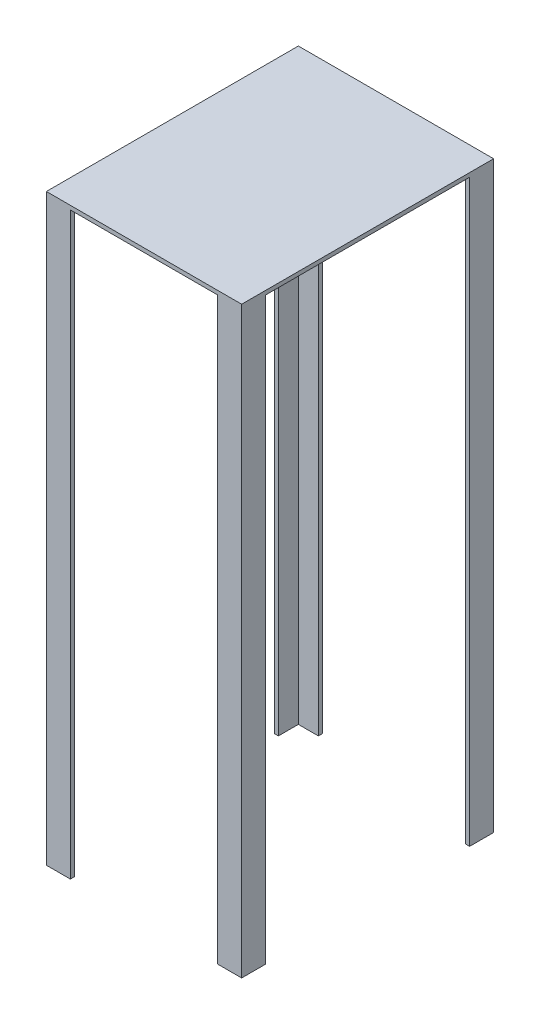
ISO-10303-21;
HEADER;
FILE_DESCRIPTION(('STEP AP214'),'2;1');
FILE_NAME('part.step','',(''),(''),'','','');
FILE_SCHEMA(('AUTOMOTIVE_DESIGN { 1 0 10303 214 1 1 1 1 }'));
ENDSEC;
DATA;
#1=APPLICATION_CONTEXT('core data for automotive mechanical design processes');
#2=APPLICATION_PROTOCOL_DEFINITION('international standard','automotive_design',2000,#1);
#3=PRODUCT_CONTEXT('',#1,'mechanical');
#4=PRODUCT('Part','Part','',(#3));
#5=PRODUCT_RELATED_PRODUCT_CATEGORY('part','',(#4));
#6=PRODUCT_DEFINITION_FORMATION('','',#4);
#7=PRODUCT_DEFINITION_CONTEXT('part definition',#1,'design');
#8=PRODUCT_DEFINITION('design','',#6,#7);
#9=PRODUCT_DEFINITION_SHAPE('','',#8);
#10=(LENGTH_UNIT() NAMED_UNIT(*) SI_UNIT(.MILLI.,.METRE.));
#11=(NAMED_UNIT(*) PLANE_ANGLE_UNIT() SI_UNIT($,.RADIAN.));
#12=(NAMED_UNIT(*) SI_UNIT($,.STERADIAN.) SOLID_ANGLE_UNIT());
#13=UNCERTAINTY_MEASURE_WITH_UNIT(LENGTH_MEASURE(1.E-05),#10,'distance_accuracy_value','');
#14=(GEOMETRIC_REPRESENTATION_CONTEXT(3) GLOBAL_UNCERTAINTY_ASSIGNED_CONTEXT((#13)) GLOBAL_UNIT_ASSIGNED_CONTEXT((#10,
#11,#12)) REPRESENTATION_CONTEXT('',''));
#15=CARTESIAN_POINT('',(0.,0.,0.));
#16=DIRECTION('',(0.,0.,1.));
#17=DIRECTION('',(1.,0.,0.));
#18=AXIS2_PLACEMENT_3D('',#15,#16,#17);
#19=CARTESIAN_POINT('',(0.,-6.35,0.));
#20=DIRECTION('',(0.,-1.,0.));
#21=DIRECTION('',(0.,0.,-1.));
#22=AXIS2_PLACEMENT_3D('',#19,#20,#21);
#23=PLANE('',#22);
#24=DIRECTION('',(-1.,0.,0.));
#25=VECTOR('',#24,1.);
#26=CARTESIAN_POINT('',(6.35,-6.35,-393.65));
#27=LINE('',#26,#25);
#28=CARTESIAN_POINT('',(38.1,-6.35,-393.65));
#29=VERTEX_POINT('',#28);
#30=CARTESIAN_POINT('',(6.35,-6.35,-393.65));
#31=VERTEX_POINT('',#30);
#32=EDGE_CURVE('E383',#29,#31,#27,.T.);
#33=ORIENTED_EDGE('',*,*,#32,.F.);
#34=DIRECTION('',(0.,0.,1.));
#35=VECTOR('',#34,1.);
#36=CARTESIAN_POINT('',(38.1,-6.35,-393.65));
#37=LINE('',#36,#35);
#38=CARTESIAN_POINT('',(38.1,-6.35,-400.));
#39=VERTEX_POINT('',#38);
#40=EDGE_CURVE('E381',#39,#29,#37,.T.);
#41=ORIENTED_EDGE('',*,*,#40,.F.);
#42=DIRECTION('',(-1.,0.,0.));
#43=VECTOR('',#42,1.);
#44=CARTESIAN_POINT('',(0.,-6.35,-400.));
#45=LINE('',#44,#43);
#46=CARTESIAN_POINT('',(271.9,-6.35,-400.));
#47=VERTEX_POINT('',#46);
#48=EDGE_CURVE('E222',#47,#39,#45,.T.);
#49=ORIENTED_EDGE('',*,*,#48,.F.);
#50=DIRECTION('',(0.,0.,-1.));
#51=VECTOR('',#50,1.);
#52=CARTESIAN_POINT('',(271.9,-6.35,-393.65));
#53=LINE('',#52,#51);
#54=CARTESIAN_POINT('',(271.9,-6.35,-393.65));
#55=VERTEX_POINT('',#54);
#56=EDGE_CURVE('E235',#55,#47,#53,.T.);
#57=ORIENTED_EDGE('',*,*,#56,.F.);
#58=DIRECTION('',(-1.,0.,0.));
#59=VECTOR('',#58,1.);
#60=CARTESIAN_POINT('',(303.65,-6.35,-393.65));
#61=LINE('',#60,#59);
#62=CARTESIAN_POINT('',(303.65,-6.35,-393.65));
#63=VERTEX_POINT('',#62);
#64=EDGE_CURVE('E248',#63,#55,#61,.T.);
#65=ORIENTED_EDGE('',*,*,#64,.F.);
#66=DIRECTION('',(0.,0.,-1.));
#67=VECTOR('',#66,1.);
#68=CARTESIAN_POINT('',(303.65,-6.35,-393.65));
#69=LINE('',#68,#67);
#70=CARTESIAN_POINT('',(303.65,-6.35,-361.9));
#71=VERTEX_POINT('',#70);
#72=EDGE_CURVE('E225',#71,#63,#69,.T.);
#73=ORIENTED_EDGE('',*,*,#72,.F.);
#74=DIRECTION('',(-1.,0.,0.));
#75=VECTOR('',#74,1.);
#76=CARTESIAN_POINT('',(303.65,-6.35,-361.9));
#77=LINE('',#76,#75);
#78=CARTESIAN_POINT('',(310.,-6.35,-361.9));
#79=VERTEX_POINT('',#78);
#80=EDGE_CURVE('E223',#79,#71,#77,.T.);
#81=ORIENTED_EDGE('',*,*,#80,.F.);
#82=DIRECTION('',(0.,0.,-1.));
#83=VECTOR('',#82,1.);
#84=CARTESIAN_POINT('',(310.,-6.35,0.));
#85=LINE('',#84,#83);
#86=CARTESIAN_POINT('',(310.,-6.35,-38.1));
#87=VERTEX_POINT('',#86);
#88=EDGE_CURVE('E342',#87,#79,#85,.T.);
#89=ORIENTED_EDGE('',*,*,#88,.F.);
#90=DIRECTION('',(1.,0.,0.));
#91=VECTOR('',#90,1.);
#92=CARTESIAN_POINT('',(303.65,-6.35,-38.1));
#93=LINE('',#92,#91);
#94=CARTESIAN_POINT('',(303.65,-6.35,-38.1));
#95=VERTEX_POINT('',#94);
#96=EDGE_CURVE('E268',#95,#87,#93,.T.);
#97=ORIENTED_EDGE('',*,*,#96,.F.);
#98=DIRECTION('',(0.,0.,-1.));
#99=VECTOR('',#98,1.);
#100=CARTESIAN_POINT('',(303.65,-6.35,-6.35));
#101=LINE('',#100,#99);
#102=CARTESIAN_POINT('',(303.65,-6.35,-6.35));
#103=VERTEX_POINT('',#102);
#104=EDGE_CURVE('E282',#103,#95,#101,.T.);
#105=ORIENTED_EDGE('',*,*,#104,.F.);
#106=DIRECTION('',(1.,0.,0.));
#107=VECTOR('',#106,1.);
#108=CARTESIAN_POINT('',(303.65,-6.35,-6.35));
#109=LINE('',#108,#107);
#110=CARTESIAN_POINT('',(271.9,-6.35,-6.35));
#111=VERTEX_POINT('',#110);
#112=EDGE_CURVE('E280',#111,#103,#109,.T.);
#113=ORIENTED_EDGE('',*,*,#112,.F.);
#114=DIRECTION('',(0.,0.,-1.));
#115=VECTOR('',#114,1.);
#116=CARTESIAN_POINT('',(271.9,-6.35,-6.35));
#117=LINE('',#116,#115);
#118=CARTESIAN_POINT('',(271.9,-6.35,0.));
#119=VERTEX_POINT('',#118);
#120=EDGE_CURVE('E263',#119,#111,#117,.T.);
#121=ORIENTED_EDGE('',*,*,#120,.F.);
#122=DIRECTION('',(1.,0.,0.));
#123=VECTOR('',#122,1.);
#124=CARTESIAN_POINT('',(0.,-6.35,0.));
#125=LINE('',#124,#123);
#126=CARTESIAN_POINT('',(38.1,-6.35,0.));
#127=VERTEX_POINT('',#126);
#128=EDGE_CURVE('E338',#127,#119,#125,.T.);
#129=ORIENTED_EDGE('',*,*,#128,.F.);
#130=DIRECTION('',(0.,0.,1.));
#131=VECTOR('',#130,1.);
#132=CARTESIAN_POINT('',(38.1,-6.35,-6.35));
#133=LINE('',#132,#131);
#134=CARTESIAN_POINT('',(38.1,-6.35,-6.35));
#135=VERTEX_POINT('',#134);
#136=EDGE_CURVE('E58',#135,#127,#133,.T.);
#137=ORIENTED_EDGE('',*,*,#136,.F.);
#138=DIRECTION('',(1.,0.,0.));
#139=VECTOR('',#138,1.);
#140=CARTESIAN_POINT('',(6.35,-6.35,-6.35));
#141=LINE('',#140,#139);
#142=CARTESIAN_POINT('',(6.35,-6.35,-6.35));
#143=VERTEX_POINT('',#142);
#144=EDGE_CURVE('E318',#143,#135,#141,.T.);
#145=ORIENTED_EDGE('',*,*,#144,.F.);
#146=DIRECTION('',(0.,0.,1.));
#147=VECTOR('',#146,1.);
#148=CARTESIAN_POINT('',(6.35,-6.35,-6.35));
#149=LINE('',#148,#147);
#150=CARTESIAN_POINT('',(6.35,-6.35,-38.1));
#151=VERTEX_POINT('',#150);
#152=EDGE_CURVE('E315',#151,#143,#149,.T.);
#153=ORIENTED_EDGE('',*,*,#152,.F.);
#154=DIRECTION('',(1.,0.,0.));
#155=VECTOR('',#154,1.);
#156=CARTESIAN_POINT('',(6.35,-6.35,-38.1));
#157=LINE('',#156,#155);
#158=CARTESIAN_POINT('',(0.,-6.35,-38.1));
#159=VERTEX_POINT('',#158);
#160=EDGE_CURVE('E297',#159,#151,#157,.T.);
#161=ORIENTED_EDGE('',*,*,#160,.F.);
#162=DIRECTION('',(0.,0.,1.));
#163=VECTOR('',#162,1.);
#164=CARTESIAN_POINT('',(0.,-6.35,0.));
#165=LINE('',#164,#163);
#166=CARTESIAN_POINT('',(0.,-6.35,-361.9));
#167=VERTEX_POINT('',#166);
#168=EDGE_CURVE('E336',#167,#159,#165,.T.);
#169=ORIENTED_EDGE('',*,*,#168,.F.);
#170=DIRECTION('',(-1.,0.,0.));
#171=VECTOR('',#170,1.);
#172=CARTESIAN_POINT('',(6.35,-6.35,-361.9));
#173=LINE('',#172,#171);
#174=CARTESIAN_POINT('',(6.35,-6.35,-361.9));
#175=VERTEX_POINT('',#174);
#176=EDGE_CURVE('E215',#175,#167,#173,.T.);
#177=ORIENTED_EDGE('',*,*,#176,.F.);
#178=DIRECTION('',(0.,0.,1.));
#179=VECTOR('',#178,1.);
#180=CARTESIAN_POINT('',(6.35,-6.35,-393.65));
#181=LINE('',#180,#179);
#182=EDGE_CURVE('E385',#31,#175,#181,.T.);
#183=ORIENTED_EDGE('',*,*,#182,.F.);
#184=EDGE_LOOP('',(#33,#41,#49,#57,#65,#73,#81,#89,#97,#105,#113,#121,#129,#137,#145,#153,#161,
#169,#177,#183));
#185=FACE_BOUND('',#184,.T.);
#186=ADVANCED_FACE('F33',(#185),#23,.T.);
#187=CARTESIAN_POINT('',(0.,-6.35,0.));
#188=DIRECTION('',(-1.,0.,0.));
#189=DIRECTION('',(0.,0.,1.));
#190=AXIS2_PLACEMENT_3D('',#187,#188,#189);
#191=PLANE('',#190);
#192=DIRECTION('',(0.,0.,1.));
#193=VECTOR('',#192,1.);
#194=CARTESIAN_POINT('',(0.,0.,0.));
#195=LINE('',#194,#193);
#196=CARTESIAN_POINT('',(0.,0.,-400.));
#197=VERTEX_POINT('',#196);
#198=CARTESIAN_POINT('',(0.,0.,0.));
#199=VERTEX_POINT('',#198);
#200=EDGE_CURVE('E335',#197,#199,#195,.T.);
#201=ORIENTED_EDGE('',*,*,#200,.F.);
#202=DIRECTION('',(0.,1.,0.));
#203=VECTOR('',#202,1.);
#204=CARTESIAN_POINT('',(0.,-6.35,-400.));
#205=LINE('',#204,#203);
#206=CARTESIAN_POINT('',(0.,-926.35,-400.));
#207=VERTEX_POINT('',#206);
#208=EDGE_CURVE('E11',#207,#197,#205,.T.);
#209=ORIENTED_EDGE('',*,*,#208,.F.);
#210=DIRECTION('',(0.,0.,-1.));
#211=VECTOR('',#210,1.);
#212=CARTESIAN_POINT('',(0.,-926.35,-400.));
#213=LINE('',#212,#211);
#214=CARTESIAN_POINT('',(0.,-926.35,-361.9));
#215=VERTEX_POINT('',#214);
#216=EDGE_CURVE('E213',#215,#207,#213,.T.);
#217=ORIENTED_EDGE('',*,*,#216,.F.);
#218=DIRECTION('',(0.,1.,0.));
#219=VECTOR('',#218,1.);
#220=CARTESIAN_POINT('',(0.,-926.35,-361.9));
#221=LINE('',#220,#219);
#222=EDGE_CURVE('E371',#215,#167,#221,.T.);
#223=ORIENTED_EDGE('',*,*,#222,.T.);
#224=ORIENTED_EDGE('',*,*,#168,.T.);
#225=DIRECTION('',(0.,1.,0.));
#226=VECTOR('',#225,1.);
#227=CARTESIAN_POINT('',(0.,-926.35,-38.1));
#228=LINE('',#227,#226);
#229=CARTESIAN_POINT('',(0.,-926.35,-38.1));
#230=VERTEX_POINT('',#229);
#231=EDGE_CURVE('E332',#230,#159,#228,.T.);
#232=ORIENTED_EDGE('',*,*,#231,.F.);
#233=DIRECTION('',(0.,0.,-1.));
#234=VECTOR('',#233,1.);
#235=CARTESIAN_POINT('',(0.,-926.35,0.));
#236=LINE('',#235,#234);
#237=CARTESIAN_POINT('',(0.,-926.35,0.));
#238=VERTEX_POINT('',#237);
#239=EDGE_CURVE('E298',#238,#230,#236,.T.);
#240=ORIENTED_EDGE('',*,*,#239,.F.);
#241=DIRECTION('',(0.,1.,0.));
#242=VECTOR('',#241,1.);
#243=CARTESIAN_POINT('',(0.,-6.35,0.));
#244=LINE('',#243,#242);
#245=EDGE_CURVE('E37',#238,#199,#244,.T.);
#246=ORIENTED_EDGE('',*,*,#245,.T.);
#247=EDGE_LOOP('',(#201,#209,#217,#223,#224,#232,#240,#246));
#248=FACE_BOUND('',#247,.T.);
#249=ADVANCED_FACE('F35',(#248),#191,.T.);
#250=CARTESIAN_POINT('',(0.,-6.35,-400.));
#251=DIRECTION('',(0.,0.,-1.));
#252=DIRECTION('',(-1.,0.,0.));
#253=AXIS2_PLACEMENT_3D('',#250,#251,#252);
#254=PLANE('',#253);
#255=DIRECTION('',(-1.,0.,0.));
#256=VECTOR('',#255,1.);
#257=CARTESIAN_POINT('',(0.,0.,-400.));
#258=LINE('',#257,#256);
#259=CARTESIAN_POINT('',(310.,0.,-400.));
#260=VERTEX_POINT('',#259);
#261=EDGE_CURVE('E339',#260,#197,#258,.T.);
#262=ORIENTED_EDGE('',*,*,#261,.F.);
#263=DIRECTION('',(0.,1.,0.));
#264=VECTOR('',#263,1.);
#265=CARTESIAN_POINT('',(310.,-6.35,-400.));
#266=LINE('',#265,#264);
#267=CARTESIAN_POINT('',(310.,-926.35,-400.));
#268=VERTEX_POINT('',#267);
#269=EDGE_CURVE('E42',#268,#260,#266,.T.);
#270=ORIENTED_EDGE('',*,*,#269,.F.);
#271=DIRECTION('',(1.,0.,0.));
#272=VECTOR('',#271,1.);
#273=CARTESIAN_POINT('',(310.,-926.35,-400.));
#274=LINE('',#273,#272);
#275=CARTESIAN_POINT('',(271.9,-926.35,-400.));
#276=VERTEX_POINT('',#275);
#277=EDGE_CURVE('E243',#276,#268,#274,.T.);
#278=ORIENTED_EDGE('',*,*,#277,.F.);
#279=DIRECTION('',(0.,1.,0.));
#280=VECTOR('',#279,1.);
#281=CARTESIAN_POINT('',(271.9,-926.35,-400.));
#282=LINE('',#281,#280);
#283=EDGE_CURVE('E245',#276,#47,#282,.T.);
#284=ORIENTED_EDGE('',*,*,#283,.T.);
#285=ORIENTED_EDGE('',*,*,#48,.T.);
#286=DIRECTION('',(0.,1.,0.));
#287=VECTOR('',#286,1.);
#288=CARTESIAN_POINT('',(38.1,-926.35,-400.));
#289=LINE('',#288,#287);
#290=CARTESIAN_POINT('',(38.1,-926.35,-400.));
#291=VERTEX_POINT('',#290);
#292=EDGE_CURVE('E200',#291,#39,#289,.T.);
#293=ORIENTED_EDGE('',*,*,#292,.F.);
#294=DIRECTION('',(1.,0.,0.));
#295=VECTOR('',#294,1.);
#296=CARTESIAN_POINT('',(0.,-926.35,-400.));
#297=LINE('',#296,#295);
#298=EDGE_CURVE('E207',#207,#291,#297,.T.);
#299=ORIENTED_EDGE('',*,*,#298,.F.);
#300=ORIENTED_EDGE('',*,*,#208,.T.);
#301=EDGE_LOOP('',(#262,#270,#278,#284,#285,#293,#299,#300));
#302=FACE_BOUND('',#301,.T.);
#303=ADVANCED_FACE('F219',(#302),#254,.T.);
#304=CARTESIAN_POINT('',(310.,-6.35,0.));
#305=DIRECTION('',(1.,0.,0.));
#306=DIRECTION('',(0.,0.,-1.));
#307=AXIS2_PLACEMENT_3D('',#304,#305,#306);
#308=PLANE('',#307);
#309=DIRECTION('',(0.,0.,-1.));
#310=VECTOR('',#309,1.);
#311=CARTESIAN_POINT('',(310.,0.,0.));
#312=LINE('',#311,#310);
#313=CARTESIAN_POINT('',(310.,0.,0.));
#314=VERTEX_POINT('',#313);
#315=EDGE_CURVE('E350',#314,#260,#312,.T.);
#316=ORIENTED_EDGE('',*,*,#315,.F.);
#317=DIRECTION('',(0.,1.,0.));
#318=VECTOR('',#317,1.);
#319=CARTESIAN_POINT('',(310.,-6.35,0.));
#320=LINE('',#319,#318);
#321=CARTESIAN_POINT('',(310.,-926.35,0.));
#322=VERTEX_POINT('',#321);
#323=EDGE_CURVE('E355',#322,#314,#320,.T.);
#324=ORIENTED_EDGE('',*,*,#323,.F.);
#325=DIRECTION('',(0.,0.,1.));
#326=VECTOR('',#325,1.);
#327=CARTESIAN_POINT('',(310.,-926.35,0.));
#328=LINE('',#327,#326);
#329=CARTESIAN_POINT('',(310.,-926.35,-38.1));
#330=VERTEX_POINT('',#329);
#331=EDGE_CURVE('E276',#330,#322,#328,.T.);
#332=ORIENTED_EDGE('',*,*,#331,.F.);
#333=DIRECTION('',(0.,1.,0.));
#334=VECTOR('',#333,1.);
#335=CARTESIAN_POINT('',(310.,-926.35,-38.1));
#336=LINE('',#335,#334);
#337=EDGE_CURVE('E50',#330,#87,#336,.T.);
#338=ORIENTED_EDGE('',*,*,#337,.T.);
#339=ORIENTED_EDGE('',*,*,#88,.T.);
#340=DIRECTION('',(0.,1.,0.));
#341=VECTOR('',#340,1.);
#342=CARTESIAN_POINT('',(310.,-926.35,-361.9));
#343=LINE('',#342,#341);
#344=CARTESIAN_POINT('',(310.,-926.35,-361.9));
#345=VERTEX_POINT('',#344);
#346=EDGE_CURVE('E261',#345,#79,#343,.T.);
#347=ORIENTED_EDGE('',*,*,#346,.F.);
#348=DIRECTION('',(0.,0.,1.));
#349=VECTOR('',#348,1.);
#350=CARTESIAN_POINT('',(310.,-926.35,-400.));
#351=LINE('',#350,#349);
#352=EDGE_CURVE('E231',#268,#345,#351,.T.);
#353=ORIENTED_EDGE('',*,*,#352,.F.);
#354=ORIENTED_EDGE('',*,*,#269,.T.);
#355=EDGE_LOOP('',(#316,#324,#332,#338,#339,#347,#353,#354));
#356=FACE_BOUND('',#355,.T.);
#357=ADVANCED_FACE('F427',(#356),#308,.T.);
#358=CARTESIAN_POINT('',(0.,-6.35,0.));
#359=DIRECTION('',(0.,0.,1.));
#360=DIRECTION('',(1.,0.,0.));
#361=AXIS2_PLACEMENT_3D('',#358,#359,#360);
#362=PLANE('',#361);
#363=DIRECTION('',(1.,0.,0.));
#364=VECTOR('',#363,1.);
#365=CARTESIAN_POINT('',(0.,0.,0.));
#366=LINE('',#365,#364);
#367=EDGE_CURVE('E347',#199,#314,#366,.T.);
#368=ORIENTED_EDGE('',*,*,#367,.F.);
#369=ORIENTED_EDGE('',*,*,#245,.F.);
#370=DIRECTION('',(-1.,0.,0.));
#371=VECTOR('',#370,1.);
#372=CARTESIAN_POINT('',(0.,-926.35,0.));
#373=LINE('',#372,#371);
#374=CARTESIAN_POINT('',(38.1,-926.35,0.));
#375=VERTEX_POINT('',#374);
#376=EDGE_CURVE('E309',#375,#238,#373,.T.);
#377=ORIENTED_EDGE('',*,*,#376,.F.);
#378=DIRECTION('',(0.,1.,0.));
#379=VECTOR('',#378,1.);
#380=CARTESIAN_POINT('',(38.1,-926.35,0.));
#381=LINE('',#380,#379);
#382=EDGE_CURVE('E312',#375,#127,#381,.T.);
#383=ORIENTED_EDGE('',*,*,#382,.T.);
#384=ORIENTED_EDGE('',*,*,#128,.T.);
#385=DIRECTION('',(0.,1.,0.));
#386=VECTOR('',#385,1.);
#387=CARTESIAN_POINT('',(271.9,-926.35,0.));
#388=LINE('',#387,#386);
#389=CARTESIAN_POINT('',(271.9,-926.35,0.));
#390=VERTEX_POINT('',#389);
#391=EDGE_CURVE('E295',#390,#119,#388,.T.);
#392=ORIENTED_EDGE('',*,*,#391,.F.);
#393=DIRECTION('',(-1.,0.,0.));
#394=VECTOR('',#393,1.);
#395=CARTESIAN_POINT('',(310.,-926.35,0.));
#396=LINE('',#395,#394);
#397=EDGE_CURVE('E264',#322,#390,#396,.T.);
#398=ORIENTED_EDGE('',*,*,#397,.F.);
#399=ORIENTED_EDGE('',*,*,#323,.T.);
#400=EDGE_LOOP('',(#368,#369,#377,#383,#384,#392,#398,#399));
#401=FACE_BOUND('',#400,.T.);
#402=ADVANCED_FACE('F365',(#401),#362,.T.);
#403=CARTESIAN_POINT('',(0.,0.,0.));
#404=DIRECTION('',(0.,-1.,0.));
#405=DIRECTION('',(0.,0.,-1.));
#406=AXIS2_PLACEMENT_3D('',#403,#404,#405);
#407=PLANE('',#406);
#408=ORIENTED_EDGE('',*,*,#200,.T.);
#409=ORIENTED_EDGE('',*,*,#367,.T.);
#410=ORIENTED_EDGE('',*,*,#315,.T.);
#411=ORIENTED_EDGE('',*,*,#261,.T.);
#412=EDGE_LOOP('',(#408,#409,#410,#411));
#413=FACE_BOUND('',#412,.T.);
#414=ADVANCED_FACE('F367',(#413),#407,.F.);
#415=CARTESIAN_POINT('',(6.35,-926.35,-38.1));
#416=DIRECTION('',(0.,0.,1.));
#417=DIRECTION('',(1.,0.,0.));
#418=AXIS2_PLACEMENT_3D('',#415,#416,#417);
#419=PLANE('',#418);
#420=ORIENTED_EDGE('',*,*,#160,.T.);
#421=DIRECTION('',(0.,1.,0.));
#422=VECTOR('',#421,1.);
#423=CARTESIAN_POINT('',(6.35,-926.35,-38.1));
#424=LINE('',#423,#422);
#425=CARTESIAN_POINT('',(6.35,-926.35,-38.1));
#426=VERTEX_POINT('',#425);
#427=EDGE_CURVE('E329',#426,#151,#424,.T.);
#428=ORIENTED_EDGE('',*,*,#427,.F.);
#429=DIRECTION('',(1.,0.,0.));
#430=VECTOR('',#429,1.);
#431=CARTESIAN_POINT('',(6.35,-926.35,-38.1));
#432=LINE('',#431,#430);
#433=EDGE_CURVE('E301',#230,#426,#432,.T.);
#434=ORIENTED_EDGE('',*,*,#433,.F.);
#435=ORIENTED_EDGE('',*,*,#231,.T.);
#436=EDGE_LOOP('',(#420,#428,#434,#435));
#437=FACE_BOUND('',#436,.T.);
#438=ADVANCED_FACE('F421',(#437),#419,.F.);
#439=CARTESIAN_POINT('',(6.35,-926.35,-6.35));
#440=DIRECTION('',(-1.,0.,0.));
#441=DIRECTION('',(0.,0.,1.));
#442=AXIS2_PLACEMENT_3D('',#439,#440,#441);
#443=PLANE('',#442);
#444=ORIENTED_EDGE('',*,*,#152,.T.);
#445=DIRECTION('',(0.,1.,0.));
#446=VECTOR('',#445,1.);
#447=CARTESIAN_POINT('',(6.35,-926.35,-6.35));
#448=LINE('',#447,#446);
#449=CARTESIAN_POINT('',(6.35,-926.35,-6.35));
#450=VERTEX_POINT('',#449);
#451=EDGE_CURVE('E326',#450,#143,#448,.T.);
#452=ORIENTED_EDGE('',*,*,#451,.F.);
#453=DIRECTION('',(0.,0.,1.));
#454=VECTOR('',#453,1.);
#455=CARTESIAN_POINT('',(6.35,-926.35,-6.35));
#456=LINE('',#455,#454);
#457=EDGE_CURVE('E303',#426,#450,#456,.T.);
#458=ORIENTED_EDGE('',*,*,#457,.F.);
#459=ORIENTED_EDGE('',*,*,#427,.T.);
#460=EDGE_LOOP('',(#444,#452,#458,#459));
#461=FACE_BOUND('',#460,.T.);
#462=ADVANCED_FACE('F444',(#461),#443,.F.);
#463=CARTESIAN_POINT('',(6.35,-926.35,-6.35));
#464=DIRECTION('',(0.,0.,1.));
#465=DIRECTION('',(1.,0.,0.));
#466=AXIS2_PLACEMENT_3D('',#463,#464,#465);
#467=PLANE('',#466);
#468=ORIENTED_EDGE('',*,*,#144,.T.);
#469=DIRECTION('',(0.,1.,0.));
#470=VECTOR('',#469,1.);
#471=CARTESIAN_POINT('',(38.1,-926.35,-6.35));
#472=LINE('',#471,#470);
#473=CARTESIAN_POINT('',(38.1,-926.35,-6.35));
#474=VERTEX_POINT('',#473);
#475=EDGE_CURVE('E323',#474,#135,#472,.T.);
#476=ORIENTED_EDGE('',*,*,#475,.F.);
#477=DIRECTION('',(1.,0.,0.));
#478=VECTOR('',#477,1.);
#479=CARTESIAN_POINT('',(6.35,-926.35,-6.35));
#480=LINE('',#479,#478);
#481=EDGE_CURVE('E305',#450,#474,#480,.T.);
#482=ORIENTED_EDGE('',*,*,#481,.F.);
#483=ORIENTED_EDGE('',*,*,#451,.T.);
#484=EDGE_LOOP('',(#468,#476,#482,#483));
#485=FACE_BOUND('',#484,.T.);
#486=ADVANCED_FACE('F451',(#485),#467,.F.);
#487=CARTESIAN_POINT('',(38.1,-926.35,-6.35));
#488=DIRECTION('',(-1.,0.,0.));
#489=DIRECTION('',(0.,0.,1.));
#490=AXIS2_PLACEMENT_3D('',#487,#488,#489);
#491=PLANE('',#490);
#492=ORIENTED_EDGE('',*,*,#136,.T.);
#493=ORIENTED_EDGE('',*,*,#382,.F.);
#494=DIRECTION('',(0.,0.,1.));
#495=VECTOR('',#494,1.);
#496=CARTESIAN_POINT('',(38.1,-926.35,-6.35));
#497=LINE('',#496,#495);
#498=EDGE_CURVE('E307',#474,#375,#497,.T.);
#499=ORIENTED_EDGE('',*,*,#498,.F.);
#500=ORIENTED_EDGE('',*,*,#475,.T.);
#501=EDGE_LOOP('',(#492,#493,#499,#500));
#502=FACE_BOUND('',#501,.T.);
#503=ADVANCED_FACE('F458',(#502),#491,.F.);
#504=CARTESIAN_POINT('',(0.,-926.35,0.));
#505=DIRECTION('',(0.,1.,0.));
#506=DIRECTION('',(0.,0.,1.));
#507=AXIS2_PLACEMENT_3D('',#504,#505,#506);
#508=PLANE('',#507);
#509=ORIENTED_EDGE('',*,*,#239,.T.);
#510=ORIENTED_EDGE('',*,*,#433,.T.);
#511=ORIENTED_EDGE('',*,*,#457,.T.);
#512=ORIENTED_EDGE('',*,*,#481,.T.);
#513=ORIENTED_EDGE('',*,*,#498,.T.);
#514=ORIENTED_EDGE('',*,*,#376,.T.);
#515=EDGE_LOOP('',(#509,#510,#511,#512,#513,#514));
#516=FACE_BOUND('',#515,.T.);
#517=ADVANCED_FACE('F466',(#516),#508,.F.);
#518=CARTESIAN_POINT('',(271.9,-926.35,-6.35));
#519=DIRECTION('',(1.,0.,0.));
#520=DIRECTION('',(0.,0.,-1.));
#521=AXIS2_PLACEMENT_3D('',#518,#519,#520);
#522=PLANE('',#521);
#523=ORIENTED_EDGE('',*,*,#120,.T.);
#524=DIRECTION('',(0.,1.,0.));
#525=VECTOR('',#524,1.);
#526=CARTESIAN_POINT('',(271.9,-926.35,-6.35));
#527=LINE('',#526,#525);
#528=CARTESIAN_POINT('',(271.9,-926.35,-6.35));
#529=VERTEX_POINT('',#528);
#530=EDGE_CURVE('E292',#529,#111,#527,.T.);
#531=ORIENTED_EDGE('',*,*,#530,.F.);
#532=DIRECTION('',(0.,0.,-1.));
#533=VECTOR('',#532,1.);
#534=CARTESIAN_POINT('',(271.9,-926.35,-6.35));
#535=LINE('',#534,#533);
#536=EDGE_CURVE('E267',#390,#529,#535,.T.);
#537=ORIENTED_EDGE('',*,*,#536,.F.);
#538=ORIENTED_EDGE('',*,*,#391,.T.);
#539=EDGE_LOOP('',(#523,#531,#537,#538));
#540=FACE_BOUND('',#539,.T.);
#541=ADVANCED_FACE('F474',(#540),#522,.F.);
#542=CARTESIAN_POINT('',(303.65,-926.35,-6.35));
#543=DIRECTION('',(0.,0.,1.));
#544=DIRECTION('',(1.,0.,0.));
#545=AXIS2_PLACEMENT_3D('',#542,#543,#544);
#546=PLANE('',#545);
#547=ORIENTED_EDGE('',*,*,#112,.T.);
#548=DIRECTION('',(0.,1.,0.));
#549=VECTOR('',#548,1.);
#550=CARTESIAN_POINT('',(303.65,-926.35,-6.35));
#551=LINE('',#550,#549);
#552=CARTESIAN_POINT('',(303.65,-926.35,-6.35));
#553=VERTEX_POINT('',#552);
#554=EDGE_CURVE('E289',#553,#103,#551,.T.);
#555=ORIENTED_EDGE('',*,*,#554,.F.);
#556=DIRECTION('',(1.,0.,0.));
#557=VECTOR('',#556,1.);
#558=CARTESIAN_POINT('',(303.65,-926.35,-6.35));
#559=LINE('',#558,#557);
#560=EDGE_CURVE('E270',#529,#553,#559,.T.);
#561=ORIENTED_EDGE('',*,*,#560,.F.);
#562=ORIENTED_EDGE('',*,*,#530,.T.);
#563=EDGE_LOOP('',(#547,#555,#561,#562));
#564=FACE_BOUND('',#563,.T.);
#565=ADVANCED_FACE('F482',(#564),#546,.F.);
#566=CARTESIAN_POINT('',(303.65,-926.35,-6.35));
#567=DIRECTION('',(1.,0.,0.));
#568=DIRECTION('',(0.,0.,-1.));
#569=AXIS2_PLACEMENT_3D('',#566,#567,#568);
#570=PLANE('',#569);
#571=ORIENTED_EDGE('',*,*,#104,.T.);
#572=DIRECTION('',(0.,1.,0.));
#573=VECTOR('',#572,1.);
#574=CARTESIAN_POINT('',(303.65,-926.35,-38.1));
#575=LINE('',#574,#573);
#576=CARTESIAN_POINT('',(303.65,-926.35,-38.1));
#577=VERTEX_POINT('',#576);
#578=EDGE_CURVE('E286',#577,#95,#575,.T.);
#579=ORIENTED_EDGE('',*,*,#578,.F.);
#580=DIRECTION('',(0.,0.,-1.));
#581=VECTOR('',#580,1.);
#582=CARTESIAN_POINT('',(303.65,-926.35,-6.35));
#583=LINE('',#582,#581);
#584=EDGE_CURVE('E272',#553,#577,#583,.T.);
#585=ORIENTED_EDGE('',*,*,#584,.F.);
#586=ORIENTED_EDGE('',*,*,#554,.T.);
#587=EDGE_LOOP('',(#571,#579,#585,#586));
#588=FACE_BOUND('',#587,.T.);
#589=ADVANCED_FACE('F490',(#588),#570,.F.);
#590=CARTESIAN_POINT('',(303.65,-926.35,-38.1));
#591=DIRECTION('',(0.,0.,1.));
#592=DIRECTION('',(1.,0.,0.));
#593=AXIS2_PLACEMENT_3D('',#590,#591,#592);
#594=PLANE('',#593);
#595=ORIENTED_EDGE('',*,*,#96,.T.);
#596=ORIENTED_EDGE('',*,*,#337,.F.);
#597=DIRECTION('',(1.,0.,0.));
#598=VECTOR('',#597,1.);
#599=CARTESIAN_POINT('',(303.65,-926.35,-38.1));
#600=LINE('',#599,#598);
#601=EDGE_CURVE('E274',#577,#330,#600,.T.);
#602=ORIENTED_EDGE('',*,*,#601,.F.);
#603=ORIENTED_EDGE('',*,*,#578,.T.);
#604=EDGE_LOOP('',(#595,#596,#602,#603));
#605=FACE_BOUND('',#604,.T.);
#606=ADVANCED_FACE('F498',(#605),#594,.F.);
#607=CARTESIAN_POINT('',(0.,-926.35,0.));
#608=DIRECTION('',(0.,1.,0.));
#609=DIRECTION('',(0.,0.,1.));
#610=AXIS2_PLACEMENT_3D('',#607,#608,#609);
#611=PLANE('',#610);
#612=ORIENTED_EDGE('',*,*,#397,.T.);
#613=ORIENTED_EDGE('',*,*,#536,.T.);
#614=ORIENTED_EDGE('',*,*,#560,.T.);
#615=ORIENTED_EDGE('',*,*,#584,.T.);
#616=ORIENTED_EDGE('',*,*,#601,.T.);
#617=ORIENTED_EDGE('',*,*,#331,.T.);
#618=EDGE_LOOP('',(#612,#613,#614,#615,#616,#617));
#619=FACE_BOUND('',#618,.T.);
#620=ADVANCED_FACE('F506',(#619),#611,.F.);
#621=CARTESIAN_POINT('',(303.65,-926.35,-361.9));
#622=DIRECTION('',(0.,0.,-1.));
#623=DIRECTION('',(-1.,0.,0.));
#624=AXIS2_PLACEMENT_3D('',#621,#622,#623);
#625=PLANE('',#624);
#626=ORIENTED_EDGE('',*,*,#80,.T.);
#627=DIRECTION('',(0.,1.,0.));
#628=VECTOR('',#627,1.);
#629=CARTESIAN_POINT('',(303.65,-926.35,-361.9));
#630=LINE('',#629,#628);
#631=CARTESIAN_POINT('',(303.65,-926.35,-361.9));
#632=VERTEX_POINT('',#631);
#633=EDGE_CURVE('E258',#632,#71,#630,.T.);
#634=ORIENTED_EDGE('',*,*,#633,.F.);
#635=DIRECTION('',(-1.,0.,0.));
#636=VECTOR('',#635,1.);
#637=CARTESIAN_POINT('',(303.65,-926.35,-361.9));
#638=LINE('',#637,#636);
#639=EDGE_CURVE('E234',#345,#632,#638,.T.);
#640=ORIENTED_EDGE('',*,*,#639,.F.);
#641=ORIENTED_EDGE('',*,*,#346,.T.);
#642=EDGE_LOOP('',(#626,#634,#640,#641));
#643=FACE_BOUND('',#642,.T.);
#644=ADVANCED_FACE('F514',(#643),#625,.F.);
#645=CARTESIAN_POINT('',(303.65,-926.35,-393.65));
#646=DIRECTION('',(1.,0.,0.));
#647=DIRECTION('',(0.,0.,-1.));
#648=AXIS2_PLACEMENT_3D('',#645,#646,#647);
#649=PLANE('',#648);
#650=ORIENTED_EDGE('',*,*,#72,.T.);
#651=DIRECTION('',(0.,1.,0.));
#652=VECTOR('',#651,1.);
#653=CARTESIAN_POINT('',(303.65,-926.35,-393.65));
#654=LINE('',#653,#652);
#655=CARTESIAN_POINT('',(303.65,-926.35,-393.65));
#656=VERTEX_POINT('',#655);
#657=EDGE_CURVE('E255',#656,#63,#654,.T.);
#658=ORIENTED_EDGE('',*,*,#657,.F.);
#659=DIRECTION('',(0.,0.,-1.));
#660=VECTOR('',#659,1.);
#661=CARTESIAN_POINT('',(303.65,-926.35,-393.65));
#662=LINE('',#661,#660);
#663=EDGE_CURVE('E237',#632,#656,#662,.T.);
#664=ORIENTED_EDGE('',*,*,#663,.F.);
#665=ORIENTED_EDGE('',*,*,#633,.T.);
#666=EDGE_LOOP('',(#650,#658,#664,#665));
#667=FACE_BOUND('',#666,.T.);
#668=ADVANCED_FACE('F522',(#667),#649,.F.);
#669=CARTESIAN_POINT('',(303.65,-926.35,-393.65));
#670=DIRECTION('',(0.,0.,-1.));
#671=DIRECTION('',(-1.,0.,0.));
#672=AXIS2_PLACEMENT_3D('',#669,#670,#671);
#673=PLANE('',#672);
#674=ORIENTED_EDGE('',*,*,#64,.T.);
#675=DIRECTION('',(0.,1.,0.));
#676=VECTOR('',#675,1.);
#677=CARTESIAN_POINT('',(271.9,-926.35,-393.65));
#678=LINE('',#677,#676);
#679=CARTESIAN_POINT('',(271.9,-926.35,-393.65));
#680=VERTEX_POINT('',#679);
#681=EDGE_CURVE('E252',#680,#55,#678,.T.);
#682=ORIENTED_EDGE('',*,*,#681,.F.);
#683=DIRECTION('',(-1.,0.,0.));
#684=VECTOR('',#683,1.);
#685=CARTESIAN_POINT('',(303.65,-926.35,-393.65));
#686=LINE('',#685,#684);
#687=EDGE_CURVE('E239',#656,#680,#686,.T.);
#688=ORIENTED_EDGE('',*,*,#687,.F.);
#689=ORIENTED_EDGE('',*,*,#657,.T.);
#690=EDGE_LOOP('',(#674,#682,#688,#689));
#691=FACE_BOUND('',#690,.T.);
#692=ADVANCED_FACE('F530',(#691),#673,.F.);
#693=CARTESIAN_POINT('',(271.9,-926.35,-393.65));
#694=DIRECTION('',(1.,0.,0.));
#695=DIRECTION('',(0.,0.,-1.));
#696=AXIS2_PLACEMENT_3D('',#693,#694,#695);
#697=PLANE('',#696);
#698=ORIENTED_EDGE('',*,*,#56,.T.);
#699=ORIENTED_EDGE('',*,*,#283,.F.);
#700=DIRECTION('',(0.,0.,-1.));
#701=VECTOR('',#700,1.);
#702=CARTESIAN_POINT('',(271.9,-926.35,-393.65));
#703=LINE('',#702,#701);
#704=EDGE_CURVE('E241',#680,#276,#703,.T.);
#705=ORIENTED_EDGE('',*,*,#704,.F.);
#706=ORIENTED_EDGE('',*,*,#681,.T.);
#707=EDGE_LOOP('',(#698,#699,#705,#706));
#708=FACE_BOUND('',#707,.T.);
#709=ADVANCED_FACE('F538',(#708),#697,.F.);
#710=CARTESIAN_POINT('',(0.,-926.35,0.));
#711=DIRECTION('',(0.,1.,0.));
#712=DIRECTION('',(0.,0.,1.));
#713=AXIS2_PLACEMENT_3D('',#710,#711,#712);
#714=PLANE('',#713);
#715=ORIENTED_EDGE('',*,*,#352,.T.);
#716=ORIENTED_EDGE('',*,*,#639,.T.);
#717=ORIENTED_EDGE('',*,*,#663,.T.);
#718=ORIENTED_EDGE('',*,*,#687,.T.);
#719=ORIENTED_EDGE('',*,*,#704,.T.);
#720=ORIENTED_EDGE('',*,*,#277,.T.);
#721=EDGE_LOOP('',(#715,#716,#717,#718,#719,#720));
#722=FACE_BOUND('',#721,.T.);
#723=ADVANCED_FACE('F412',(#722),#714,.F.);
#724=CARTESIAN_POINT('',(38.1,-926.35,-393.65));
#725=DIRECTION('',(-1.,0.,0.));
#726=DIRECTION('',(0.,0.,1.));
#727=AXIS2_PLACEMENT_3D('',#724,#725,#726);
#728=PLANE('',#727);
#729=ORIENTED_EDGE('',*,*,#40,.T.);
#730=DIRECTION('',(0.,1.,0.));
#731=VECTOR('',#730,1.);
#732=CARTESIAN_POINT('',(38.1,-926.35,-393.65));
#733=LINE('',#732,#731);
#734=CARTESIAN_POINT('',(38.1,-926.35,-393.65));
#735=VERTEX_POINT('',#734);
#736=EDGE_CURVE('E203',#735,#29,#733,.T.);
#737=ORIENTED_EDGE('',*,*,#736,.F.);
#738=DIRECTION('',(0.,0.,1.));
#739=VECTOR('',#738,1.);
#740=CARTESIAN_POINT('',(38.1,-926.35,-393.65));
#741=LINE('',#740,#739);
#742=EDGE_CURVE('E196',#291,#735,#741,.T.);
#743=ORIENTED_EDGE('',*,*,#742,.F.);
#744=ORIENTED_EDGE('',*,*,#292,.T.);
#745=EDGE_LOOP('',(#729,#737,#743,#744));
#746=FACE_BOUND('',#745,.T.);
#747=ADVANCED_FACE('F198',(#746),#728,.F.);
#748=CARTESIAN_POINT('',(6.35,-926.35,-393.65));
#749=DIRECTION('',(0.,0.,-1.));
#750=DIRECTION('',(-1.,0.,0.));
#751=AXIS2_PLACEMENT_3D('',#748,#749,#750);
#752=PLANE('',#751);
#753=ORIENTED_EDGE('',*,*,#32,.T.);
#754=DIRECTION('',(0.,1.,0.));
#755=VECTOR('',#754,1.);
#756=CARTESIAN_POINT('',(6.35,-926.35,-393.65));
#757=LINE('',#756,#755);
#758=CARTESIAN_POINT('',(6.35,-926.35,-393.65));
#759=VERTEX_POINT('',#758);
#760=EDGE_CURVE('E227',#759,#31,#757,.T.);
#761=ORIENTED_EDGE('',*,*,#760,.F.);
#762=DIRECTION('',(-1.,0.,0.));
#763=VECTOR('',#762,1.);
#764=CARTESIAN_POINT('',(6.35,-926.35,-393.65));
#765=LINE('',#764,#763);
#766=EDGE_CURVE('E206',#735,#759,#765,.T.);
#767=ORIENTED_EDGE('',*,*,#766,.F.);
#768=ORIENTED_EDGE('',*,*,#736,.T.);
#769=EDGE_LOOP('',(#753,#761,#767,#768));
#770=FACE_BOUND('',#769,.T.);
#771=ADVANCED_FACE('F404',(#770),#752,.F.);
#772=CARTESIAN_POINT('',(6.35,-926.35,-393.65));
#773=DIRECTION('',(-1.,0.,0.));
#774=DIRECTION('',(0.,0.,1.));
#775=AXIS2_PLACEMENT_3D('',#772,#773,#774);
#776=PLANE('',#775);
#777=ORIENTED_EDGE('',*,*,#182,.T.);
#778=DIRECTION('',(0.,1.,0.));
#779=VECTOR('',#778,1.);
#780=CARTESIAN_POINT('',(6.35,-926.35,-361.9));
#781=LINE('',#780,#779);
#782=CARTESIAN_POINT('',(6.35,-926.35,-361.9));
#783=VERTEX_POINT('',#782);
#784=EDGE_CURVE('E375',#783,#175,#781,.T.);
#785=ORIENTED_EDGE('',*,*,#784,.F.);
#786=DIRECTION('',(0.,0.,1.));
#787=VECTOR('',#786,1.);
#788=CARTESIAN_POINT('',(6.35,-926.35,-393.65));
#789=LINE('',#788,#787);
#790=EDGE_CURVE('E377',#759,#783,#789,.T.);
#791=ORIENTED_EDGE('',*,*,#790,.F.);
#792=ORIENTED_EDGE('',*,*,#760,.T.);
#793=EDGE_LOOP('',(#777,#785,#791,#792));
#794=FACE_BOUND('',#793,.T.);
#795=ADVANCED_FACE('F394',(#794),#776,.F.);
#796=CARTESIAN_POINT('',(6.35,-926.35,-361.9));
#797=DIRECTION('',(0.,0.,-1.));
#798=DIRECTION('',(-1.,0.,0.));
#799=AXIS2_PLACEMENT_3D('',#796,#797,#798);
#800=PLANE('',#799);
#801=ORIENTED_EDGE('',*,*,#176,.T.);
#802=ORIENTED_EDGE('',*,*,#222,.F.);
#803=DIRECTION('',(-1.,0.,0.));
#804=VECTOR('',#803,1.);
#805=CARTESIAN_POINT('',(6.35,-926.35,-361.9));
#806=LINE('',#805,#804);
#807=EDGE_CURVE('E373',#783,#215,#806,.T.);
#808=ORIENTED_EDGE('',*,*,#807,.F.);
#809=ORIENTED_EDGE('',*,*,#784,.T.);
#810=EDGE_LOOP('',(#801,#802,#808,#809));
#811=FACE_BOUND('',#810,.T.);
#812=ADVANCED_FACE('F401',(#811),#800,.F.);
#813=CARTESIAN_POINT('',(0.,-926.35,0.));
#814=DIRECTION('',(0.,1.,0.));
#815=DIRECTION('',(0.,0.,1.));
#816=AXIS2_PLACEMENT_3D('',#813,#814,#815);
#817=PLANE('',#816);
#818=ORIENTED_EDGE('',*,*,#298,.T.);
#819=ORIENTED_EDGE('',*,*,#742,.T.);
#820=ORIENTED_EDGE('',*,*,#766,.T.);
#821=ORIENTED_EDGE('',*,*,#790,.T.);
#822=ORIENTED_EDGE('',*,*,#807,.T.);
#823=ORIENTED_EDGE('',*,*,#216,.T.);
#824=EDGE_LOOP('',(#818,#819,#820,#821,#822,#823));
#825=FACE_BOUND('',#824,.T.);
#826=ADVANCED_FACE('F211',(#825),#817,.F.);
#827=CLOSED_SHELL('',(#186,#249,#303,#357,#402,#414,#438,#462,#486,#503,#517,#541,#565,#589,
#606,#620,#644,#668,#692,#709,#723,#747,#771,#795,#812,#826));
#828=MANIFOLD_SOLID_BREP('B2',#827);
#829=ADVANCED_BREP_SHAPE_REPRESENTATION('',(#18,#828),#14);
#830=SHAPE_DEFINITION_REPRESENTATION(#9,#829);
ENDSEC;
END-ISO-10303-21;
